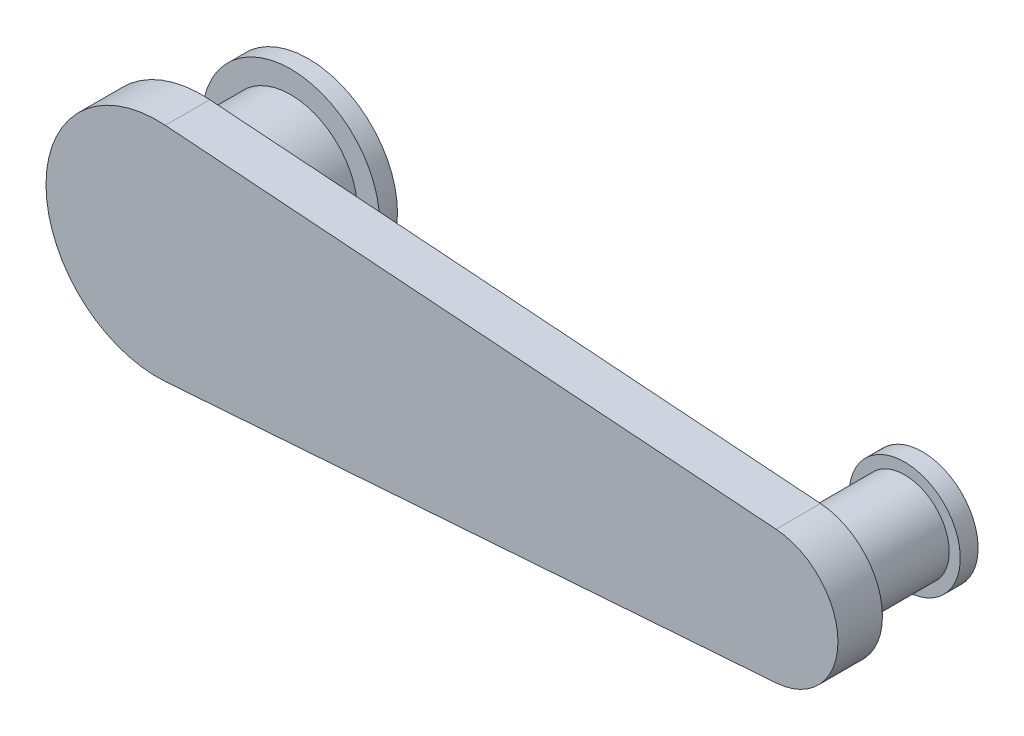
ISO-10303-21;
HEADER;
FILE_DESCRIPTION(('STEP AP214'),'2;1');
FILE_NAME('part.step','',(''),(''),'','','');
FILE_SCHEMA(('AUTOMOTIVE_DESIGN { 1 0 10303 214 1 1 1 1 }'));
ENDSEC;
DATA;
#1=APPLICATION_CONTEXT('core data for automotive mechanical design processes');
#2=APPLICATION_PROTOCOL_DEFINITION('international standard','automotive_design',2000,#1);
#3=PRODUCT_CONTEXT('',#1,'mechanical');
#4=PRODUCT('Part','Part','',(#3));
#5=PRODUCT_RELATED_PRODUCT_CATEGORY('part','',(#4));
#6=PRODUCT_DEFINITION_FORMATION('','',#4);
#7=PRODUCT_DEFINITION_CONTEXT('part definition',#1,'design');
#8=PRODUCT_DEFINITION('design','',#6,#7);
#9=PRODUCT_DEFINITION_SHAPE('','',#8);
#10=(LENGTH_UNIT() NAMED_UNIT(*) SI_UNIT(.MILLI.,.METRE.));
#11=(NAMED_UNIT(*) PLANE_ANGLE_UNIT() SI_UNIT($,.RADIAN.));
#12=(NAMED_UNIT(*) SI_UNIT($,.STERADIAN.) SOLID_ANGLE_UNIT());
#13=UNCERTAINTY_MEASURE_WITH_UNIT(LENGTH_MEASURE(1.E-05),#10,'distance_accuracy_value','');
#14=(GEOMETRIC_REPRESENTATION_CONTEXT(3) GLOBAL_UNCERTAINTY_ASSIGNED_CONTEXT((#13)) GLOBAL_UNIT_ASSIGNED_CONTEXT((#10,
#11,#12)) REPRESENTATION_CONTEXT('',''));
#15=CARTESIAN_POINT('',(0.,0.,0.));
#16=DIRECTION('',(0.,0.,1.));
#17=DIRECTION('',(1.,0.,0.));
#18=AXIS2_PLACEMENT_3D('',#15,#16,#17);
#19=CARTESIAN_POINT('',(0.,0.,-25.));
#20=DIRECTION('',(0.,0.,1.));
#21=DIRECTION('',(1.,0.,0.));
#22=AXIS2_PLACEMENT_3D('',#19,#20,#21);
#23=PLANE('',#22);
#24=CARTESIAN_POINT('',(400.,0.,-25.));
#25=DIRECTION('',(0.,0.,1.));
#26=DIRECTION('',(1.,0.,0.));
#27=AXIS2_PLACEMENT_3D('',#24,#25,#26);
#28=CIRCLE('',#27,50.);
#29=CARTESIAN_POINT('',(450.,0.,-25.));
#30=VERTEX_POINT('',#29);
#31=EDGE_CURVE('E12',#30,#30,#28,.F.);
#32=ORIENTED_EDGE('',*,*,#31,.F.);
#33=EDGE_LOOP('',(#32));
#34=FACE_BOUND('',#33,.T.);
#35=CARTESIAN_POINT('',(-290.,0.,-25.));
#36=DIRECTION('',(0.,0.,1.));
#37=DIRECTION('',(1.,0.,0.));
#38=AXIS2_PLACEMENT_3D('',#35,#36,#37);
#39=CIRCLE('',#38,75.);
#40=CARTESIAN_POINT('',(-215.,0.,-25.));
#41=VERTEX_POINT('',#40);
#42=EDGE_CURVE('E134',#41,#41,#39,.F.);
#43=ORIENTED_EDGE('',*,*,#42,.F.);
#44=EDGE_LOOP('',(#43));
#45=FACE_BOUND('',#44,.T.);
#46=DIRECTION('',(0.997371045454218,0.072463768115942,0.));
#47=VECTOR('',#46,1.);
#48=CARTESIAN_POINT('',(7.53518168452006,-103.712134074406,-25.));
#49=LINE('',#48,#47);
#50=CARTESIAN_POINT('',(-280.942028985507,-124.671380681777,-25.));
#51=VERTEX_POINT('',#50);
#52=CARTESIAN_POINT('',(405.434782608696,-74.8028284090664,-25.));
#53=VERTEX_POINT('',#52);
#54=EDGE_CURVE('E192',#51,#53,#49,.T.);
#55=ORIENTED_EDGE('',*,*,#54,.F.);
#56=CARTESIAN_POINT('',(-290.,0.,-25.));
#57=DIRECTION('',(0.,0.,1.));
#58=DIRECTION('',(1.,0.,0.));
#59=AXIS2_PLACEMENT_3D('',#56,#57,#58);
#60=CIRCLE('',#59,125.);
#61=CARTESIAN_POINT('',(-280.942028985507,124.671380681777,-25.));
#62=VERTEX_POINT('',#61);
#63=EDGE_CURVE('E161',#62,#51,#60,.T.);
#64=ORIENTED_EDGE('',*,*,#63,.F.);
#65=DIRECTION('',(0.997371045454218,-0.072463768115942,0.));
#66=VECTOR('',#65,1.);
#67=CARTESIAN_POINT('',(7.53518168452006,103.712134074406,-25.));
#68=LINE('',#67,#66);
#69=CARTESIAN_POINT('',(405.434782608696,74.8028284090664,-25.));
#70=VERTEX_POINT('',#69);
#71=EDGE_CURVE('E197',#62,#70,#68,.T.);
#72=ORIENTED_EDGE('',*,*,#71,.T.);
#73=CARTESIAN_POINT('',(400.,0.,-25.));
#74=DIRECTION('',(0.,0.,1.));
#75=DIRECTION('',(1.,0.,0.));
#76=AXIS2_PLACEMENT_3D('',#73,#74,#75);
#77=CIRCLE('',#76,75.);
#78=EDGE_CURVE('E176',#70,#53,#77,.F.);
#79=ORIENTED_EDGE('',*,*,#78,.T.);
#80=EDGE_LOOP('',(#55,#64,#72,#79));
#81=FACE_BOUND('',#80,.T.);
#82=ADVANCED_FACE('F125',(#34,#45,#81),#23,.F.);
#83=CARTESIAN_POINT('',(400.,0.,25.));
#84=DIRECTION('',(0.,0.,-1.));
#85=DIRECTION('',(-1.,0.,0.));
#86=AXIS2_PLACEMENT_3D('',#83,#84,#85);
#87=CYLINDRICAL_SURFACE('',#86,75.);
#88=ORIENTED_EDGE('',*,*,#78,.F.);
#89=DIRECTION('',(0.,0.,-1.));
#90=VECTOR('',#89,1.);
#91=CARTESIAN_POINT('',(405.434782608696,74.8028284090664,25.));
#92=LINE('',#91,#90);
#93=CARTESIAN_POINT('',(405.434782608696,74.8028284090664,25.));
#94=VERTEX_POINT('',#93);
#95=EDGE_CURVE('E172',#94,#70,#92,.T.);
#96=ORIENTED_EDGE('',*,*,#95,.F.);
#97=CARTESIAN_POINT('',(400.,0.,25.));
#98=DIRECTION('',(0.,0.,1.));
#99=DIRECTION('',(1.,0.,0.));
#100=AXIS2_PLACEMENT_3D('',#97,#98,#99);
#101=CIRCLE('',#100,75.);
#102=CARTESIAN_POINT('',(405.434782608696,-74.8028284090664,25.));
#103=VERTEX_POINT('',#102);
#104=EDGE_CURVE('E174',#94,#103,#101,.F.);
#105=ORIENTED_EDGE('',*,*,#104,.T.);
#106=DIRECTION('',(0.,0.,-1.));
#107=VECTOR('',#106,1.);
#108=CARTESIAN_POINT('',(405.434782608696,-74.8028284090664,25.));
#109=LINE('',#108,#107);
#110=EDGE_CURVE('E181',#103,#53,#109,.T.);
#111=ORIENTED_EDGE('',*,*,#110,.T.);
#112=EDGE_LOOP('',(#88,#96,#105,#111));
#113=FACE_BOUND('',#112,.T.);
#114=ADVANCED_FACE('F173',(#113),#87,.T.);
#115=CARTESIAN_POINT('',(7.53518168452006,103.712134074406,25.));
#116=DIRECTION('',(0.072463768115942,0.997371045454218,0.));
#117=DIRECTION('',(-0.997371045454218,0.072463768115942,0.));
#118=AXIS2_PLACEMENT_3D('',#115,#116,#117);
#119=PLANE('',#118);
#120=ORIENTED_EDGE('',*,*,#71,.F.);
#121=DIRECTION('',(0.,0.,-1.));
#122=VECTOR('',#121,1.);
#123=CARTESIAN_POINT('',(-280.942028985507,124.671380681777,25.));
#124=LINE('',#123,#122);
#125=CARTESIAN_POINT('',(-280.942028985507,124.671380681777,25.));
#126=VERTEX_POINT('',#125);
#127=EDGE_CURVE('E158',#126,#62,#124,.T.);
#128=ORIENTED_EDGE('',*,*,#127,.F.);
#129=DIRECTION('',(0.997371045454218,-0.072463768115942,0.));
#130=VECTOR('',#129,1.);
#131=CARTESIAN_POINT('',(7.53518168452006,103.712134074406,25.));
#132=LINE('',#131,#130);
#133=EDGE_CURVE('E184',#126,#94,#132,.T.);
#134=ORIENTED_EDGE('',*,*,#133,.T.);
#135=ORIENTED_EDGE('',*,*,#95,.T.);
#136=EDGE_LOOP('',(#120,#128,#134,#135));
#137=FACE_BOUND('',#136,.T.);
#138=ADVANCED_FACE('F186',(#137),#119,.T.);
#139=CARTESIAN_POINT('',(-290.,0.,25.));
#140=DIRECTION('',(0.,0.,-1.));
#141=DIRECTION('',(-1.,0.,0.));
#142=AXIS2_PLACEMENT_3D('',#139,#140,#141);
#143=CYLINDRICAL_SURFACE('',#142,125.);
#144=ORIENTED_EDGE('',*,*,#63,.T.);
#145=DIRECTION('',(0.,0.,-1.));
#146=VECTOR('',#145,1.);
#147=CARTESIAN_POINT('',(-280.942028985507,-124.671380681777,25.));
#148=LINE('',#147,#146);
#149=CARTESIAN_POINT('',(-280.942028985507,-124.671380681777,25.));
#150=VERTEX_POINT('',#149);
#151=EDGE_CURVE('E188',#150,#51,#148,.T.);
#152=ORIENTED_EDGE('',*,*,#151,.F.);
#153=CARTESIAN_POINT('',(-290.,0.,25.));
#154=DIRECTION('',(0.,0.,1.));
#155=DIRECTION('',(1.,0.,0.));
#156=AXIS2_PLACEMENT_3D('',#153,#154,#155);
#157=CIRCLE('',#156,125.);
#158=EDGE_CURVE('E142',#126,#150,#157,.T.);
#159=ORIENTED_EDGE('',*,*,#158,.F.);
#160=ORIENTED_EDGE('',*,*,#127,.T.);
#161=EDGE_LOOP('',(#144,#152,#159,#160));
#162=FACE_BOUND('',#161,.T.);
#163=ADVANCED_FACE('F213',(#162),#143,.T.);
#164=CARTESIAN_POINT('',(7.53518168452006,-103.712134074406,25.));
#165=DIRECTION('',(-0.072463768115942,0.997371045454218,0.));
#166=DIRECTION('',(-0.997371045454218,-0.072463768115942,0.));
#167=AXIS2_PLACEMENT_3D('',#164,#165,#166);
#168=PLANE('',#167);
#169=ORIENTED_EDGE('',*,*,#54,.T.);
#170=ORIENTED_EDGE('',*,*,#110,.F.);
#171=DIRECTION('',(0.997371045454218,0.072463768115942,0.));
#172=VECTOR('',#171,1.);
#173=CARTESIAN_POINT('',(7.53518168452006,-103.712134074406,25.));
#174=LINE('',#173,#172);
#175=EDGE_CURVE('E166',#150,#103,#174,.T.);
#176=ORIENTED_EDGE('',*,*,#175,.F.);
#177=ORIENTED_EDGE('',*,*,#151,.T.);
#178=EDGE_LOOP('',(#169,#170,#176,#177));
#179=FACE_BOUND('',#178,.T.);
#180=ADVANCED_FACE('F127',(#179),#168,.F.);
#181=CARTESIAN_POINT('',(0.,0.,25.));
#182=DIRECTION('',(0.,0.,1.));
#183=DIRECTION('',(1.,0.,0.));
#184=AXIS2_PLACEMENT_3D('',#181,#182,#183);
#185=PLANE('',#184);
#186=ORIENTED_EDGE('',*,*,#175,.T.);
#187=ORIENTED_EDGE('',*,*,#104,.F.);
#188=ORIENTED_EDGE('',*,*,#133,.F.);
#189=ORIENTED_EDGE('',*,*,#158,.T.);
#190=EDGE_LOOP('',(#186,#187,#188,#189));
#191=FACE_BOUND('',#190,.T.);
#192=ADVANCED_FACE('F183',(#191),#185,.T.);
#193=CARTESIAN_POINT('',(-290.,0.,-125.));
#194=DIRECTION('',(0.,0.,1.));
#195=DIRECTION('',(1.,0.,0.));
#196=AXIS2_PLACEMENT_3D('',#193,#194,#195);
#197=CYLINDRICAL_SURFACE('',#196,75.);
#198=CARTESIAN_POINT('',(-290.,0.,-125.));
#199=DIRECTION('',(0.,0.,-1.));
#200=DIRECTION('',(-1.,0.,0.));
#201=AXIS2_PLACEMENT_3D('',#198,#199,#200);
#202=CIRCLE('',#201,75.);
#203=CARTESIAN_POINT('',(-365.,0.,-125.));
#204=VERTEX_POINT('',#203);
#205=EDGE_CURVE('E195',#204,#204,#202,.T.);
#206=ORIENTED_EDGE('',*,*,#205,.F.);
#207=EDGE_LOOP('',(#206));
#208=FACE_BOUND('',#207,.T.);
#209=ORIENTED_EDGE('',*,*,#42,.T.);
#210=EDGE_LOOP('',(#209));
#211=FACE_BOUND('',#210,.T.);
#212=ADVANCED_FACE('F205',(#208,#211),#197,.T.);
#213=CARTESIAN_POINT('',(400.,0.,-125.));
#214=DIRECTION('',(0.,0.,1.));
#215=DIRECTION('',(1.,0.,0.));
#216=AXIS2_PLACEMENT_3D('',#213,#214,#215);
#217=CYLINDRICAL_SURFACE('',#216,50.);
#218=CARTESIAN_POINT('',(400.,0.,-125.));
#219=DIRECTION('',(0.,0.,-1.));
#220=DIRECTION('',(-1.,0.,0.));
#221=AXIS2_PLACEMENT_3D('',#218,#219,#220);
#222=CIRCLE('',#221,50.);
#223=CARTESIAN_POINT('',(350.,0.,-125.));
#224=VERTEX_POINT('',#223);
#225=EDGE_CURVE('E271',#224,#224,#222,.T.);
#226=ORIENTED_EDGE('',*,*,#225,.F.);
#227=EDGE_LOOP('',(#226));
#228=FACE_BOUND('',#227,.T.);
#229=ORIENTED_EDGE('',*,*,#31,.T.);
#230=EDGE_LOOP('',(#229));
#231=FACE_BOUND('',#230,.T.);
#232=ADVANCED_FACE('F226',(#228,#231),#217,.T.);
#233=CARTESIAN_POINT('',(400.,0.,-145.));
#234=DIRECTION('',(0.,0.,1.));
#235=DIRECTION('',(1.,0.,0.));
#236=AXIS2_PLACEMENT_3D('',#233,#234,#235);
#237=CYLINDRICAL_SURFACE('',#236,62.5);
#238=CARTESIAN_POINT('',(400.,0.,-145.));
#239=DIRECTION('',(0.,0.,-1.));
#240=DIRECTION('',(-1.,0.,0.));
#241=AXIS2_PLACEMENT_3D('',#238,#239,#240);
#242=CIRCLE('',#241,62.5);
#243=CARTESIAN_POINT('',(337.5,0.,-145.));
#244=VERTEX_POINT('',#243);
#245=EDGE_CURVE('E265',#244,#244,#242,.T.);
#246=ORIENTED_EDGE('',*,*,#245,.F.);
#247=EDGE_LOOP('',(#246));
#248=FACE_BOUND('',#247,.T.);
#249=CARTESIAN_POINT('',(400.,0.,-125.));
#250=DIRECTION('',(0.,0.,-1.));
#251=DIRECTION('',(-1.,0.,0.));
#252=AXIS2_PLACEMENT_3D('',#249,#250,#251);
#253=CIRCLE('',#252,62.5);
#254=CARTESIAN_POINT('',(337.5,0.,-125.));
#255=VERTEX_POINT('',#254);
#256=EDGE_CURVE('E261',#255,#255,#253,.T.);
#257=ORIENTED_EDGE('',*,*,#256,.T.);
#258=EDGE_LOOP('',(#257));
#259=FACE_BOUND('',#258,.T.);
#260=ADVANCED_FACE('F232',(#248,#259),#237,.T.);
#261=CARTESIAN_POINT('',(400.,0.,-145.));
#262=DIRECTION('',(0.,0.,-1.));
#263=DIRECTION('',(-1.,0.,0.));
#264=AXIS2_PLACEMENT_3D('',#261,#262,#263);
#265=PLANE('',#264);
#266=ORIENTED_EDGE('',*,*,#245,.T.);
#267=EDGE_LOOP('',(#266));
#268=FACE_BOUND('',#267,.T.);
#269=ADVANCED_FACE('F236',(#268),#265,.T.);
#270=CARTESIAN_POINT('',(400.,0.,-125.));
#271=DIRECTION('',(0.,0.,-1.));
#272=DIRECTION('',(-1.,0.,0.));
#273=AXIS2_PLACEMENT_3D('',#270,#271,#272);
#274=PLANE('',#273);
#275=ORIENTED_EDGE('',*,*,#225,.T.);
#276=EDGE_LOOP('',(#275));
#277=FACE_BOUND('',#276,.T.);
#278=ORIENTED_EDGE('',*,*,#256,.F.);
#279=EDGE_LOOP('',(#278));
#280=FACE_BOUND('',#279,.T.);
#281=ADVANCED_FACE('F238',(#277,#280),#274,.F.);
#282=CARTESIAN_POINT('',(-290.,0.,-145.));
#283=DIRECTION('',(0.,0.,1.));
#284=DIRECTION('',(1.,0.,0.));
#285=AXIS2_PLACEMENT_3D('',#282,#283,#284);
#286=CYLINDRICAL_SURFACE('',#285,100.);
#287=CARTESIAN_POINT('',(-290.,0.,-145.));
#288=DIRECTION('',(0.,0.,-1.));
#289=DIRECTION('',(-1.,0.,0.));
#290=AXIS2_PLACEMENT_3D('',#287,#288,#289);
#291=CIRCLE('',#290,100.);
#292=CARTESIAN_POINT('',(-390.,0.,-145.));
#293=VERTEX_POINT('',#292);
#294=EDGE_CURVE('E260',#293,#293,#291,.T.);
#295=ORIENTED_EDGE('',*,*,#294,.F.);
#296=EDGE_LOOP('',(#295));
#297=FACE_BOUND('',#296,.T.);
#298=CARTESIAN_POINT('',(-290.,0.,-125.));
#299=DIRECTION('',(0.,0.,-1.));
#300=DIRECTION('',(-1.,0.,0.));
#301=AXIS2_PLACEMENT_3D('',#298,#299,#300);
#302=CIRCLE('',#301,100.);
#303=CARTESIAN_POINT('',(-390.,0.,-125.));
#304=VERTEX_POINT('',#303);
#305=EDGE_CURVE('E262',#304,#304,#302,.T.);
#306=ORIENTED_EDGE('',*,*,#305,.T.);
#307=EDGE_LOOP('',(#306));
#308=FACE_BOUND('',#307,.T.);
#309=ADVANCED_FACE('F241',(#297,#308),#286,.T.);
#310=CARTESIAN_POINT('',(-290.,0.,-145.));
#311=DIRECTION('',(0.,0.,-1.));
#312=DIRECTION('',(-1.,0.,0.));
#313=AXIS2_PLACEMENT_3D('',#310,#311,#312);
#314=PLANE('',#313);
#315=ORIENTED_EDGE('',*,*,#294,.T.);
#316=EDGE_LOOP('',(#315));
#317=FACE_BOUND('',#316,.T.);
#318=ADVANCED_FACE('F248',(#317),#314,.T.);
#319=CARTESIAN_POINT('',(-290.,0.,-125.));
#320=DIRECTION('',(0.,0.,-1.));
#321=DIRECTION('',(-1.,0.,0.));
#322=AXIS2_PLACEMENT_3D('',#319,#320,#321);
#323=PLANE('',#322);
#324=ORIENTED_EDGE('',*,*,#205,.T.);
#325=EDGE_LOOP('',(#324));
#326=FACE_BOUND('',#325,.T.);
#327=ORIENTED_EDGE('',*,*,#305,.F.);
#328=EDGE_LOOP('',(#327));
#329=FACE_BOUND('',#328,.T.);
#330=ADVANCED_FACE('F250',(#326,#329),#323,.F.);
#331=CLOSED_SHELL('',(#82,#114,#138,#163,#180,#192,#212,#232,#260,#269,#281,#309,#318,#330));
#332=MANIFOLD_SOLID_BREP('B2',#331);
#333=ADVANCED_BREP_SHAPE_REPRESENTATION('',(#18,#332),#14);
#334=SHAPE_DEFINITION_REPRESENTATION(#9,#333);
ENDSEC;
END-ISO-10303-21;
